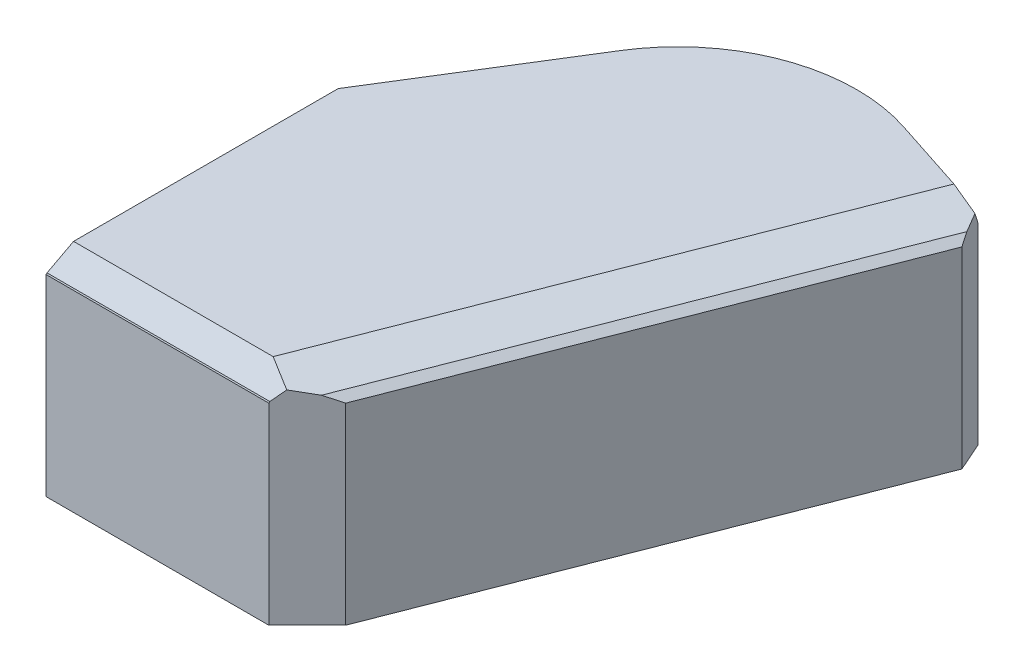
ISO-10303-21;
HEADER;
FILE_DESCRIPTION(('STEP AP214'),'2;1');
FILE_NAME('part.step','',(''),(''),'','','');
FILE_SCHEMA(('AUTOMOTIVE_DESIGN { 1 0 10303 214 1 1 1 1 }'));
ENDSEC;
DATA;
#1=APPLICATION_CONTEXT('core data for automotive mechanical design processes');
#2=APPLICATION_PROTOCOL_DEFINITION('international standard','automotive_design',2000,#1);
#3=PRODUCT_CONTEXT('',#1,'mechanical');
#4=PRODUCT('Part','Part','',(#3));
#5=PRODUCT_RELATED_PRODUCT_CATEGORY('part','',(#4));
#6=PRODUCT_DEFINITION_FORMATION('','',#4);
#7=PRODUCT_DEFINITION_CONTEXT('part definition',#1,'design');
#8=PRODUCT_DEFINITION('design','',#6,#7);
#9=PRODUCT_DEFINITION_SHAPE('','',#8);
#10=(LENGTH_UNIT() NAMED_UNIT(*) SI_UNIT(.MILLI.,.METRE.));
#11=(NAMED_UNIT(*) PLANE_ANGLE_UNIT() SI_UNIT($,.RADIAN.));
#12=(NAMED_UNIT(*) SI_UNIT($,.STERADIAN.) SOLID_ANGLE_UNIT());
#13=UNCERTAINTY_MEASURE_WITH_UNIT(LENGTH_MEASURE(1.E-05),#10,'distance_accuracy_value','');
#14=(GEOMETRIC_REPRESENTATION_CONTEXT(3) GLOBAL_UNCERTAINTY_ASSIGNED_CONTEXT((#13)) GLOBAL_UNIT_ASSIGNED_CONTEXT((#10,
#11,#12)) REPRESENTATION_CONTEXT('',''));
#15=CARTESIAN_POINT('',(0.,0.,0.));
#16=DIRECTION('',(0.,0.,1.));
#17=DIRECTION('',(1.,0.,0.));
#18=AXIS2_PLACEMENT_3D('',#15,#16,#17);
#19=CARTESIAN_POINT('',(-66.6737685117542,58.42,0.));
#20=DIRECTION('',(1.,0.,0.));
#21=DIRECTION('',(0.,0.,-1.));
#22=AXIS2_PLACEMENT_3D('',#19,#20,#21);
#23=PLANE('',#22);
#24=DIRECTION('',(0.,-1.,0.));
#25=VECTOR('',#24,1.);
#26=CARTESIAN_POINT('',(-66.6737685117542,58.42,77.4518589102709));
#27=LINE('',#26,#25);
#28=CARTESIAN_POINT('',(-66.6737685117542,52.0699999999999,77.4518589102709));
#29=VERTEX_POINT('',#28);
#30=CARTESIAN_POINT('',(-66.6737685117542,0.,77.4518589102709));
#31=VERTEX_POINT('',#30);
#32=EDGE_CURVE('E134',#29,#31,#27,.T.);
#33=ORIENTED_EDGE('',*,*,#32,.F.);
#34=DIRECTION('',(0.,0.,-1.));
#35=VECTOR('',#34,1.);
#36=CARTESIAN_POINT('',(-66.6737685117542,52.0699999999999,0.));
#37=LINE('',#36,#35);
#38=CARTESIAN_POINT('',(-66.6737685117542,52.0699999999999,0.));
#39=VERTEX_POINT('',#38);
#40=EDGE_CURVE('E11',#29,#39,#37,.T.);
#41=ORIENTED_EDGE('',*,*,#40,.T.);
#42=DIRECTION('',(0.,-1.,0.));
#43=VECTOR('',#42,1.);
#44=CARTESIAN_POINT('',(-66.6737685117542,58.42,0.));
#45=LINE('',#44,#43);
#46=CARTESIAN_POINT('',(-66.6737685117542,0.,0.));
#47=VERTEX_POINT('',#46);
#48=EDGE_CURVE('E155',#39,#47,#45,.T.);
#49=ORIENTED_EDGE('',*,*,#48,.T.);
#50=DIRECTION('',(0.,0.,1.));
#51=VECTOR('',#50,1.);
#52=CARTESIAN_POINT('',(-66.6737685117542,0.,0.));
#53=LINE('',#52,#51);
#54=EDGE_CURVE('E151',#47,#31,#53,.T.);
#55=ORIENTED_EDGE('',*,*,#54,.T.);
#56=EDGE_LOOP('',(#33,#41,#49,#55));
#57=FACE_BOUND('',#56,.T.);
#58=ADVANCED_FACE('F33',(#57),#23,.F.);
#59=CARTESIAN_POINT('',(0.,58.42,77.4518589102709));
#60=DIRECTION('',(0.,0.,-1.));
#61=DIRECTION('',(-1.,0.,0.));
#62=AXIS2_PLACEMENT_3D('',#59,#60,#61);
#63=PLANE('',#62);
#64=DIRECTION('',(0.,1.,0.));
#65=VECTOR('',#64,1.);
#66=CARTESIAN_POINT('',(-6.35000000000003,58.42,77.4518589102709));
#67=LINE('',#66,#65);
#68=CARTESIAN_POINT('',(-6.35000000000003,0.,77.4518589102709));
#69=VERTEX_POINT('',#68);
#70=CARTESIAN_POINT('',(-6.35000000000003,52.0699999999999,77.4518589102709));
#71=VERTEX_POINT('',#70);
#72=EDGE_CURVE('E186',#69,#71,#67,.T.);
#73=ORIENTED_EDGE('',*,*,#72,.T.);
#74=DIRECTION('',(-1.,0.,0.));
#75=VECTOR('',#74,1.);
#76=CARTESIAN_POINT('',(0.,52.0699999999999,77.4518589102709));
#77=LINE('',#76,#75);
#78=EDGE_CURVE('E141',#71,#29,#77,.T.);
#79=ORIENTED_EDGE('',*,*,#78,.T.);
#80=ORIENTED_EDGE('',*,*,#32,.T.);
#81=DIRECTION('',(1.,0.,0.));
#82=VECTOR('',#81,1.);
#83=CARTESIAN_POINT('',(0.,0.,77.4518589102709));
#84=LINE('',#83,#82);
#85=EDGE_CURVE('E138',#31,#69,#84,.T.);
#86=ORIENTED_EDGE('',*,*,#85,.T.);
#87=EDGE_LOOP('',(#73,#79,#80,#86));
#88=FACE_BOUND('',#87,.T.);
#89=ADVANCED_FACE('F137',(#88),#63,.F.);
#90=CARTESIAN_POINT('',(53.1384921973379,58.42,-58.9035172942189));
#91=DIRECTION('',(-0.93174729177176,0.,-0.363107400469877));
#92=DIRECTION('',(-0.363107400469877,0.,0.93174729177176));
#93=AXIS2_PLACEMENT_3D('',#90,#91,#92);
#94=PLANE('',#93);
#95=DIRECTION('',(-0.363107400469877,0.,0.93174729177176));
#96=VECTOR('',#95,1.);
#97=CARTESIAN_POINT('',(53.1384921973379,52.07,-58.9035172942189));
#98=LINE('',#97,#96);
#99=CARTESIAN_POINT('',(50.8327602043542,52.07,-52.9869219914683));
#100=VERTEX_POINT('',#99);
#101=CARTESIAN_POINT('',(4.05481927710842,52.07,67.0470396331624));
#102=VERTEX_POINT('',#101);
#103=EDGE_CURVE('E178',#100,#102,#98,.T.);
#104=ORIENTED_EDGE('',*,*,#103,.T.);
#105=DIRECTION('',(0.,-1.,0.));
#106=VECTOR('',#105,1.);
#107=CARTESIAN_POINT('',(4.05481927710842,58.42,67.0470396331625));
#108=LINE('',#107,#106);
#109=CARTESIAN_POINT('',(4.05481927710843,0.,67.0470396331625));
#110=VERTEX_POINT('',#109);
#111=EDGE_CURVE('E180',#102,#110,#108,.T.);
#112=ORIENTED_EDGE('',*,*,#111,.T.);
#113=DIRECTION('',(0.363107400469877,0.,-0.93174729177176));
#114=VECTOR('',#113,1.);
#115=CARTESIAN_POINT('',(53.1384921973379,0.,-58.9035172942189));
#116=LINE('',#115,#114);
#117=CARTESIAN_POINT('',(50.8327602043542,0.,-52.9869219914683));
#118=VERTEX_POINT('',#117);
#119=EDGE_CURVE('E153',#110,#118,#116,.T.);
#120=ORIENTED_EDGE('',*,*,#119,.T.);
#121=DIRECTION('',(0.,1.,0.));
#122=VECTOR('',#121,1.);
#123=CARTESIAN_POINT('',(50.8327602043542,58.42,-52.9869219914683));
#124=LINE('',#123,#122);
#125=EDGE_CURVE('E143',#118,#100,#124,.T.);
#126=ORIENTED_EDGE('',*,*,#125,.T.);
#127=EDGE_LOOP('',(#104,#112,#120,#126));
#128=FACE_BOUND('',#127,.T.);
#129=ADVANCED_FACE('F282',(#128),#94,.F.);
#130=CARTESIAN_POINT('',(21.8265277700403,58.42,-69.1139404770334));
#131=DIRECTION('',(-0.310020599830917,0.,0.950729839481479));
#132=DIRECTION('',(0.950729839481479,0.,0.310020599830917));
#133=AXIS2_PLACEMENT_3D('',#130,#131,#132);
#134=PLANE('',#133);
#135=DIRECTION('',(0.,-1.,0.));
#136=VECTOR('',#135,1.);
#137=CARTESIAN_POINT('',(21.8265277700403,58.42,-69.1139404770334));
#138=LINE('',#137,#136);
#139=CARTESIAN_POINT('',(21.8265277700403,52.0699999999999,-69.1139404770334));
#140=VERTEX_POINT('',#139);
#141=CARTESIAN_POINT('',(21.8265277700403,0.,-69.1139404770334));
#142=VERTEX_POINT('',#141);
#143=EDGE_CURVE('E144',#140,#142,#138,.T.);
#144=ORIENTED_EDGE('',*,*,#143,.F.);
#145=DIRECTION('',(0.950729839481479,0.,0.310020599830917));
#146=VECTOR('',#145,1.);
#147=CARTESIAN_POINT('',(21.8265277700403,52.0699999999999,-69.1139404770334));
#148=LINE('',#147,#146);
#149=CARTESIAN_POINT('',(47.414825287296,52.0699999999999,-60.7699304170587));
#150=VERTEX_POINT('',#149);
#151=EDGE_CURVE('E223',#140,#150,#148,.T.);
#152=ORIENTED_EDGE('',*,*,#151,.T.);
#153=DIRECTION('',(0.,-1.,0.));
#154=VECTOR('',#153,1.);
#155=CARTESIAN_POINT('',(47.414825287296,58.42,-60.7699304170587));
#156=LINE('',#155,#154);
#157=CARTESIAN_POINT('',(47.414825287296,0.,-60.7699304170587));
#158=VERTEX_POINT('',#157);
#159=EDGE_CURVE('E188',#150,#158,#156,.T.);
#160=ORIENTED_EDGE('',*,*,#159,.T.);
#161=DIRECTION('',(-0.950729839481479,0.,-0.310020599830917));
#162=VECTOR('',#161,1.);
#163=CARTESIAN_POINT('',(21.8265277700403,0.,-69.1139404770334));
#164=LINE('',#163,#162);
#165=EDGE_CURVE('E165',#158,#142,#164,.T.);
#166=ORIENTED_EDGE('',*,*,#165,.T.);
#167=EDGE_LOOP('',(#144,#152,#160,#166));
#168=FACE_BOUND('',#167,.T.);
#169=ADVANCED_FACE('F260',(#168),#134,.F.);
#170=CARTESIAN_POINT('',(6.07748129862949,58.42,-20.8168646313743));
#171=DIRECTION('',(0.,-1.,0.));
#172=DIRECTION('',(0.,0.,-1.));
#173=AXIS2_PLACEMENT_3D('',#170,#171,#172);
#174=CYLINDRICAL_SURFACE('',#173,50.8);
#175=DIRECTION('',(0.,-1.,0.));
#176=VECTOR('',#175,1.);
#177=CARTESIAN_POINT('',(-37.0678218733656,58.42,-47.6333299875063));
#178=LINE('',#177,#176);
#179=CARTESIAN_POINT('',(-37.0678218733656,52.0699999999999,-47.6333299875063));
#180=VERTEX_POINT('',#179);
#181=CARTESIAN_POINT('',(-37.0678218733656,0.,-47.6333299875063));
#182=VERTEX_POINT('',#181);
#183=EDGE_CURVE('E174',#180,#182,#178,.T.);
#184=ORIENTED_EDGE('',*,*,#183,.F.);
#185=CARTESIAN_POINT('',(6.07748129862949,52.0699999999999,-20.8168646313743));
#186=DIRECTION('',(0.,-1.,0.));
#187=DIRECTION('',(0.,0.,-1.));
#188=AXIS2_PLACEMENT_3D('',#185,#186,#187);
#189=CIRCLE('',#188,50.8);
#190=EDGE_CURVE('E225',#180,#140,#189,.T.);
#191=ORIENTED_EDGE('',*,*,#190,.T.);
#192=ORIENTED_EDGE('',*,*,#143,.T.);
#193=CARTESIAN_POINT('',(6.07748129862949,0.,-20.8168646313743));
#194=DIRECTION('',(0.,1.,0.));
#195=DIRECTION('',(0.,0.,-1.));
#196=AXIS2_PLACEMENT_3D('',#193,#194,#195);
#197=CIRCLE('',#196,50.8);
#198=EDGE_CURVE('E168',#142,#182,#197,.T.);
#199=ORIENTED_EDGE('',*,*,#198,.T.);
#200=EDGE_LOOP('',(#184,#191,#192,#199));
#201=FACE_BOUND('',#200,.T.);
#202=ADVANCED_FACE('F258',(#201),#174,.T.);
#203=CARTESIAN_POINT('',(-66.6737685117542,58.42,0.));
#204=DIRECTION('',(0.849316991574704,0.,0.527883176301816));
#205=DIRECTION('',(0.527883176301816,0.,-0.849316991574704));
#206=AXIS2_PLACEMENT_3D('',#203,#204,#205);
#207=PLANE('',#206);
#208=ORIENTED_EDGE('',*,*,#48,.F.);
#209=DIRECTION('',(0.527883176301816,0.,-0.849316991574704));
#210=VECTOR('',#209,1.);
#211=CARTESIAN_POINT('',(-66.6737685117542,52.0699999999999,0.));
#212=LINE('',#211,#210);
#213=EDGE_CURVE('E42',#39,#180,#212,.T.);
#214=ORIENTED_EDGE('',*,*,#213,.T.);
#215=ORIENTED_EDGE('',*,*,#183,.T.);
#216=DIRECTION('',(-0.527883176301816,0.,0.849316991574704));
#217=VECTOR('',#216,1.);
#218=CARTESIAN_POINT('',(-66.6737685117542,0.,0.));
#219=LINE('',#218,#217);
#220=EDGE_CURVE('E171',#182,#47,#219,.T.);
#221=ORIENTED_EDGE('',*,*,#220,.T.);
#222=EDGE_LOOP('',(#208,#214,#215,#221));
#223=FACE_BOUND('',#222,.T.);
#224=ADVANCED_FACE('F265',(#223),#207,.F.);
#225=CARTESIAN_POINT('',(6.07748129862949,58.42,-20.8168646313743));
#226=DIRECTION('',(0.,-1.,0.));
#227=DIRECTION('',(0.,0.,-1.));
#228=AXIS2_PLACEMENT_3D('',#225,#226,#227);
#229=PLANE('',#228);
#230=DIRECTION('',(1.,0.,0.));
#231=VECTOR('',#230,1.);
#232=CARTESIAN_POINT('',(-5.91446010632307,58.42,72.3055279376371));
#233=LINE('',#232,#231);
#234=CARTESIAN_POINT('',(-64.3625575241638,58.42,72.3055279376371));
#235=VERTEX_POINT('',#234);
#236=CARTESIAN_POINT('',(-10.32502252787,58.42,72.3055279376371));
#237=VERTEX_POINT('',#236);
#238=EDGE_CURVE('E203',#235,#237,#233,.T.);
#239=ORIENTED_EDGE('',*,*,#238,.T.);
#240=DIRECTION('',(0.363107400469877,0.,-0.93174729177176));
#241=VECTOR('',#240,1.);
#242=CARTESIAN_POINT('',(42.3035146338703,58.42,-62.7412844019229));
#243=LINE('',#242,#241);
#244=CARTESIAN_POINT('',(41.3576327642871,58.42,-60.314115830917));
#245=VERTEX_POINT('',#244);
#246=EDGE_CURVE('E205',#237,#245,#243,.T.);
#247=ORIENTED_EDGE('',*,*,#246,.T.);
#248=DIRECTION('',(-0.950729839481479,0.,-0.310020599830917));
#249=VECTOR('',#248,1.);
#250=CARTESIAN_POINT('',(21.1100047533315,58.42,-66.9166032257938));
#251=LINE('',#250,#249);
#252=CARTESIAN_POINT('',(21.1100047533318,58.42,-66.9166032257937));
#253=VERTEX_POINT('',#252);
#254=EDGE_CURVE('E201',#245,#253,#251,.T.);
#255=ORIENTED_EDGE('',*,*,#254,.T.);
#256=CARTESIAN_POINT('',(6.07748129862949,58.42,-20.8168646313743));
#257=DIRECTION('',(0.,-1.,0.));
#258=DIRECTION('',(0.,0.,-1.));
#259=AXIS2_PLACEMENT_3D('',#256,#257,#258);
#260=CIRCLE('',#259,48.4887890124096);
#261=CARTESIAN_POINT('',(-35.104871110491,58.42,-46.4132805902735));
#262=VERTEX_POINT('',#261);
#263=EDGE_CURVE('E199',#253,#262,#260,.F.);
#264=ORIENTED_EDGE('',*,*,#263,.T.);
#265=DIRECTION('',(-0.527883176301816,0.,0.849316991574704));
#266=VECTOR('',#265,1.);
#267=CARTESIAN_POINT('',(-35.1048711104908,58.42,-46.4132805902737));
#268=LINE('',#267,#266);
#269=CARTESIAN_POINT('',(-64.3625575241638,58.42,0.659729728754608));
#270=VERTEX_POINT('',#269);
#271=EDGE_CURVE('E197',#262,#270,#268,.T.);
#272=ORIENTED_EDGE('',*,*,#271,.T.);
#273=DIRECTION('',(0.,0.,1.));
#274=VECTOR('',#273,1.);
#275=CARTESIAN_POINT('',(-64.3625575241638,58.42,-20.8168646313743));
#276=LINE('',#275,#274);
#277=EDGE_CURVE('E195',#270,#235,#276,.T.);
#278=ORIENTED_EDGE('',*,*,#277,.T.);
#279=EDGE_LOOP('',(#239,#247,#255,#264,#272,#278));
#280=FACE_BOUND('',#279,.T.);
#281=ADVANCED_FACE('F267',(#280),#229,.F.);
#282=CARTESIAN_POINT('',(6.07748129862949,0.,-20.8168646313743));
#283=DIRECTION('',(0.,-1.,0.));
#284=DIRECTION('',(0.,0.,-1.));
#285=AXIS2_PLACEMENT_3D('',#282,#283,#284);
#286=PLANE('',#285);
#287=ORIENTED_EDGE('',*,*,#119,.F.);
#288=DIRECTION('',(0.707106781186549,0.,-0.707106781186546));
#289=VECTOR('',#288,1.);
#290=CARTESIAN_POINT('',(48.9981024201374,0.,22.1037564901337));
#291=LINE('',#290,#289);
#292=EDGE_CURVE('E152',#110,#69,#291,.F.);
#293=ORIENTED_EDGE('',*,*,#292,.T.);
#294=ORIENTED_EDGE('',*,*,#85,.F.);
#295=ORIENTED_EDGE('',*,*,#54,.F.);
#296=ORIENTED_EDGE('',*,*,#220,.F.);
#297=ORIENTED_EDGE('',*,*,#198,.F.);
#298=ORIENTED_EDGE('',*,*,#165,.F.);
#299=DIRECTION('',(-0.402089123192741,0.,-0.915600533535282));
#300=VECTOR('',#299,1.);
#301=CARTESIAN_POINT('',(55.4404244481059,0.,-42.4947708822025));
#302=LINE('',#301,#300);
#303=EDGE_CURVE('E183',#158,#118,#302,.F.);
#304=ORIENTED_EDGE('',*,*,#303,.T.);
#305=EDGE_LOOP('',(#287,#293,#294,#295,#296,#297,#298,#304));
#306=FACE_BOUND('',#305,.T.);
#307=ADVANCED_FACE('F149',(#306),#286,.T.);
#308=CARTESIAN_POINT('',(47.414825287296,58.42,-60.7699304170587));
#309=DIRECTION('',(-0.915600533535282,0.,0.402089123192741));
#310=DIRECTION('',(0.,-1.,0.));
#311=AXIS2_PLACEMENT_3D('',#308,#309,#310);
#312=PLANE('',#311);
#313=DIRECTION('',(0.176343818269999,0.898697527647227,0.401553995819639));
#314=VECTOR('',#313,1.);
#315=CARTESIAN_POINT('',(48.4211717219901,57.1986235133652,-58.4783704633578));
#316=LINE('',#315,#314);
#317=CARTESIAN_POINT('',(48.056346291996,55.3393708603661,-59.3091175268382));
#318=VERTEX_POINT('',#317);
#319=EDGE_CURVE('E208',#150,#318,#316,.T.);
#320=ORIENTED_EDGE('',*,*,#319,.T.);
#321=DIRECTION('',(0.381866101129538,-0.313145613014978,0.869550519439555));
#322=VECTOR('',#321,1.);
#323=CARTESIAN_POINT('',(47.1093522583965,56.1159441835699,-61.4655256274445));
#324=LINE('',#323,#322);
#325=CARTESIAN_POINT('',(49.7751628268612,53.9298719394654,-55.3951858992536));
#326=VERTEX_POINT('',#325);
#327=EDGE_CURVE('E210',#318,#326,#324,.T.);
#328=ORIENTED_EDGE('',*,*,#327,.T.);
#329=DIRECTION('',(0.3283043943151,-0.577350269189627,0.747584705127158));
#330=VECTOR('',#329,1.);
#331=CARTESIAN_POINT('',(47.3505158230598,58.1938130397816,-60.91637004044));
#332=LINE('',#331,#330);
#333=EDGE_CURVE('E157',#100,#326,#332,.F.);
#334=ORIENTED_EDGE('',*,*,#333,.F.);
#335=ORIENTED_EDGE('',*,*,#125,.F.);
#336=ORIENTED_EDGE('',*,*,#303,.F.);
#337=ORIENTED_EDGE('',*,*,#159,.F.);
#338=EDGE_LOOP('',(#320,#328,#334,#335,#336,#337));
#339=FACE_BOUND('',#338,.T.);
#340=ADVANCED_FACE('F294',(#339),#312,.F.);
#341=CARTESIAN_POINT('',(28.1314030195225,58.42,-12.2223216077911));
#342=DIRECTION('',(-0.658844828364014,-0.707106781186546,-0.25675570517127));
#343=DIRECTION('',(0.363107400469877,0.,-0.93174729177176));
#344=AXIS2_PLACEMENT_3D('',#341,#342,#343);
#345=PLANE('',#344);
#346=ORIENTED_EDGE('',*,*,#333,.T.);
#347=DIRECTION('',(0.363107400469877,0.,-0.93174729177176));
#348=VECTOR('',#347,1.);
#349=CARTESIAN_POINT('',(-1.73079544621155,53.9298719394654,76.771046650518));
#350=LINE('',#349,#348);
#351=CARTESIAN_POINT('',(0.784081560823269,53.9298719394654,70.3177773494476));
#352=VERTEX_POINT('',#351);
#353=EDGE_CURVE('E212',#326,#352,#350,.F.);
#354=ORIENTED_EDGE('',*,*,#353,.T.);
#355=DIRECTION('',(0.656058484901172,-0.373061025541883,-0.656058484901169));
#356=VECTOR('',#355,1.);
#357=CARTESIAN_POINT('',(46.9820686166113,27.659853601696,24.1197902936597));
#358=LINE('',#357,#356);
#359=EDGE_CURVE('E160',#102,#352,#358,.F.);
#360=ORIENTED_EDGE('',*,*,#359,.F.);
#361=ORIENTED_EDGE('',*,*,#103,.F.);
#362=EDGE_LOOP('',(#346,#354,#360,#361));
#363=FACE_BOUND('',#362,.T.);
#364=ADVANCED_FACE('F290',(#363),#345,.F.);
#365=CARTESIAN_POINT('',(4.05481927710841,58.42,67.0470396331625));
#366=DIRECTION('',(-0.707106781186546,0.,-0.707106781186549));
#367=DIRECTION('',(0.,-1.,0.));
#368=AXIS2_PLACEMENT_3D('',#365,#366,#367);
#369=PLANE('',#368);
#370=ORIENTED_EDGE('',*,*,#359,.T.);
#371=DIRECTION('',(-0.694995936190551,0.184285911987987,0.694995936190548));
#372=VECTOR('',#371,1.);
#373=CARTESIAN_POINT('',(3.36865433913567,53.2445436853732,67.7332045711352));
#374=LINE('',#373,#372);
#375=CARTESIAN_POINT('',(-3.92383773627255,55.1782291686985,75.0256966465434));
#376=VERTEX_POINT('',#375);
#377=EDGE_CURVE('E217',#352,#376,#374,.T.);
#378=ORIENTED_EDGE('',*,*,#377,.T.);
#379=DIRECTION('',(-0.540716203060935,-0.644400477571777,0.540716203060932));
#380=VECTOR('',#379,1.);
#381=CARTESIAN_POINT('',(1.87122162055936,62.0845119764997,69.2306372897115));
#382=LINE('',#381,#380);
#383=CARTESIAN_POINT('',(-6.21061692252765,52.4529518580093,77.3124758327985));
#384=VERTEX_POINT('',#383);
#385=EDGE_CURVE('E215',#376,#384,#382,.T.);
#386=ORIENTED_EDGE('',*,*,#385,.T.);
#387=DIRECTION('',(-0.32361557711818,-0.889126490715992,0.323615577118179));
#388=VECTOR('',#387,1.);
#389=CARTESIAN_POINT('',(-2.34354970586344,63.0776317153077,73.4454086161343));
#390=LINE('',#389,#388);
#391=EDGE_CURVE('E190',#384,#71,#390,.T.);
#392=ORIENTED_EDGE('',*,*,#391,.T.);
#393=ORIENTED_EDGE('',*,*,#72,.F.);
#394=ORIENTED_EDGE('',*,*,#292,.F.);
#395=ORIENTED_EDGE('',*,*,#111,.F.);
#396=EDGE_LOOP('',(#370,#378,#386,#392,#393,#394,#395));
#397=FACE_BOUND('',#396,.T.);
#398=ADVANCED_FACE('F286',(#397),#369,.F.);
#399=CARTESIAN_POINT('',(6.07748129862949,58.42,75.1406479226805));
#400=DIRECTION('',(0.,-0.342020143325662,-0.939692620785911));
#401=DIRECTION('',(1.,0.,0.));
#402=AXIS2_PLACEMENT_3D('',#399,#400,#401);
#403=PLANE('',#402);
#404=ORIENTED_EDGE('',*,*,#391,.F.);
#405=DIRECTION('',(1.,0.,0.));
#406=VECTOR('',#405,1.);
#407=CARTESIAN_POINT('',(-66.6737685117542,52.4529518580093,77.3124758327985));
#408=LINE('',#407,#406);
#409=CARTESIAN_POINT('',(-66.5343854342818,52.4529518580093,77.3124758327985));
#410=VERTEX_POINT('',#409);
#411=EDGE_CURVE('E221',#384,#410,#408,.F.);
#412=ORIENTED_EDGE('',*,*,#411,.T.);
#413=DIRECTION('',(-0.32361557711818,-0.889126490715992,0.323615577118179));
#414=VECTOR('',#413,1.);
#415=CARTESIAN_POINT('',(-56.9855806372487,78.6880774206384,67.7636710357653));
#416=LINE('',#415,#414);
#417=EDGE_CURVE('E219',#410,#29,#416,.T.);
#418=ORIENTED_EDGE('',*,*,#417,.T.);
#419=ORIENTED_EDGE('',*,*,#78,.F.);
#420=EDGE_LOOP('',(#404,#412,#418,#419));
#421=FACE_BOUND('',#420,.T.);
#422=ADVANCED_FACE('F289',(#421),#403,.F.);
#423=CARTESIAN_POINT('',(-35.1048711104908,58.42,-46.4132805902737));
#424=DIRECTION('',(0.798096909690838,-0.342020143325663,0.496047925407844));
#425=DIRECTION('',(-0.527883176301816,0.,0.849316991574704));
#426=AXIS2_PLACEMENT_3D('',#423,#424,#425);
#427=PLANE('',#426);
#428=DIRECTION('',(0.290483519187304,0.93969262078591,0.180546679617952));
#429=VECTOR('',#428,1.);
#430=CARTESIAN_POINT('',(-37.0678218733656,52.0699999999999,-47.6333299875063));
#431=LINE('',#430,#429);
#432=EDGE_CURVE('E238',#180,#262,#431,.T.);
#433=ORIENTED_EDGE('',*,*,#432,.F.);
#434=ORIENTED_EDGE('',*,*,#213,.F.);
#435=DIRECTION('',(-0.340401739529073,-0.93524609289922,-0.0971668742027086));
#436=VECTOR('',#435,1.);
#437=CARTESIAN_POINT('',(-65.0729124841013,56.468315787774,0.456960579786655));
#438=LINE('',#437,#436);
#439=EDGE_CURVE('E37',#270,#39,#438,.T.);
#440=ORIENTED_EDGE('',*,*,#439,.F.);
#441=ORIENTED_EDGE('',*,*,#271,.F.);
#442=EDGE_LOOP('',(#433,#434,#440,#441));
#443=FACE_BOUND('',#442,.T.);
#444=ADVANCED_FACE('F35',(#443),#427,.F.);
#445=CARTESIAN_POINT('',(-64.3625575241638,58.42,-20.8168646313743));
#446=DIRECTION('',(0.93969262078591,-0.342020143325663,0.));
#447=DIRECTION('',(0.,0.,1.));
#448=AXIS2_PLACEMENT_3D('',#445,#446,#447);
#449=PLANE('',#448);
#450=ORIENTED_EDGE('',*,*,#40,.F.);
#451=ORIENTED_EDGE('',*,*,#417,.F.);
#452=DIRECTION('',(0.268573407547186,0.737899372701891,-0.619171091480093));
#453=VECTOR('',#452,1.);
#454=CARTESIAN_POINT('',(-48.8769657500641,100.966313726232,36.6049317820037));
#455=LINE('',#454,#453);
#456=EDGE_CURVE('E236',#235,#410,#455,.F.);
#457=ORIENTED_EDGE('',*,*,#456,.F.);
#458=ORIENTED_EDGE('',*,*,#277,.F.);
#459=ORIENTED_EDGE('',*,*,#439,.T.);
#460=EDGE_LOOP('',(#450,#451,#457,#458,#459));
#461=FACE_BOUND('',#460,.T.);
#462=ADVANCED_FACE('F248',(#461),#449,.F.);
#463=CARTESIAN_POINT('',(6.07748129862949,58.42,-20.8168646313743));
#464=DIRECTION('',(0.,-1.,0.));
#465=DIRECTION('',(0.,0.,-1.));
#466=AXIS2_PLACEMENT_3D('',#463,#464,#465);
#467=CONICAL_SURFACE('',#466,48.4887890124096,0.34906585039886);
#468=ORIENTED_EDGE('',*,*,#432,.T.);
#469=ORIENTED_EDGE('',*,*,#263,.F.);
#470=DIRECTION('',(-0.106033289988079,0.93969262078591,0.325168755963441));
#471=VECTOR('',#470,1.);
#472=CARTESIAN_POINT('',(21.8265277700403,52.0699999999999,-69.1139404770334));
#473=LINE('',#472,#471);
#474=EDGE_CURVE('E233',#140,#253,#473,.T.);
#475=ORIENTED_EDGE('',*,*,#474,.F.);
#476=ORIENTED_EDGE('',*,*,#190,.F.);
#477=EDGE_LOOP('',(#468,#469,#475,#476));
#478=FACE_BOUND('',#477,.T.);
#479=ADVANCED_FACE('F254',(#478),#467,.T.);
#480=CARTESIAN_POINT('',(6.07748129862949,58.42,72.3055279376371));
#481=DIRECTION('',(0.,-0.642787609686533,-0.766044443118983));
#482=DIRECTION('',(1.,0.,0.));
#483=AXIS2_PLACEMENT_3D('',#480,#481,#482);
#484=PLANE('',#483);
#485=ORIENTED_EDGE('',*,*,#411,.F.);
#486=ORIENTED_EDGE('',*,*,#385,.F.);
#487=DIRECTION('',(-0.834186823285329,0.422459685140191,-0.354485765988398));
#488=VECTOR('',#487,1.);
#489=CARTESIAN_POINT('',(1.08894936475065,52.6395886612486,77.1558689600362));
#490=LINE('',#489,#488);
#491=EDGE_CURVE('E230',#237,#376,#490,.F.);
#492=ORIENTED_EDGE('',*,*,#491,.F.);
#493=ORIENTED_EDGE('',*,*,#238,.F.);
#494=ORIENTED_EDGE('',*,*,#456,.T.);
#495=EDGE_LOOP('',(#485,#486,#492,#493,#494));
#496=FACE_BOUND('',#495,.T.);
#497=ADVANCED_FACE('F309',(#496),#484,.F.);
#498=CARTESIAN_POINT('',(21.1100047533315,58.42,-66.9166032257938));
#499=DIRECTION('',(-0.291324069952734,-0.342020143325663,0.893393814521719));
#500=DIRECTION('',(-0.950729839481479,0.,-0.310020599830917));
#501=AXIS2_PLACEMENT_3D('',#498,#499,#500);
#502=PLANE('',#501);
#503=ORIENTED_EDGE('',*,*,#474,.T.);
#504=ORIENTED_EDGE('',*,*,#254,.F.);
#505=DIRECTION('',(0.90020649461965,-0.413990290455295,0.135056678669891));
#506=VECTOR('',#505,1.);
#507=CARTESIAN_POINT('',(24.1468042148309,66.3349794549929,-62.8962315509647));
#508=LINE('',#507,#506);
#509=EDGE_CURVE('E228',#318,#245,#508,.F.);
#510=ORIENTED_EDGE('',*,*,#509,.F.);
#511=ORIENTED_EDGE('',*,*,#319,.F.);
#512=ORIENTED_EDGE('',*,*,#151,.F.);
#513=EDGE_LOOP('',(#503,#504,#510,#511,#512));
#514=FACE_BOUND('',#513,.T.);
#515=ADVANCED_FACE('F305',(#514),#502,.F.);
#516=CARTESIAN_POINT('',(23.3431698629337,58.42,-14.0883242349911));
#517=DIRECTION('',(-0.393773420830191,-0.906307787036647,-0.153455818411766));
#518=DIRECTION('',(0.363107400469877,0.,-0.93174729177176));
#519=AXIS2_PLACEMENT_3D('',#516,#517,#518);
#520=PLANE('',#519);
#521=ORIENTED_EDGE('',*,*,#377,.F.);
#522=ORIENTED_EDGE('',*,*,#353,.F.);
#523=ORIENTED_EDGE('',*,*,#327,.F.);
#524=ORIENTED_EDGE('',*,*,#509,.T.);
#525=ORIENTED_EDGE('',*,*,#246,.F.);
#526=ORIENTED_EDGE('',*,*,#491,.T.);
#527=EDGE_LOOP('',(#521,#522,#523,#524,#525,#526));
#528=FACE_BOUND('',#527,.T.);
#529=ADVANCED_FACE('F302',(#528),#520,.F.);
#530=CLOSED_SHELL('',(#58,#89,#129,#169,#202,#224,#281,#307,#340,#364,#398,#422,#444,#462,#479,
#497,#515,#529));
#531=MANIFOLD_SOLID_BREP('B2',#530);
#532=ADVANCED_BREP_SHAPE_REPRESENTATION('',(#18,#531),#14);
#533=SHAPE_DEFINITION_REPRESENTATION(#9,#532);
ENDSEC;
END-ISO-10303-21;
